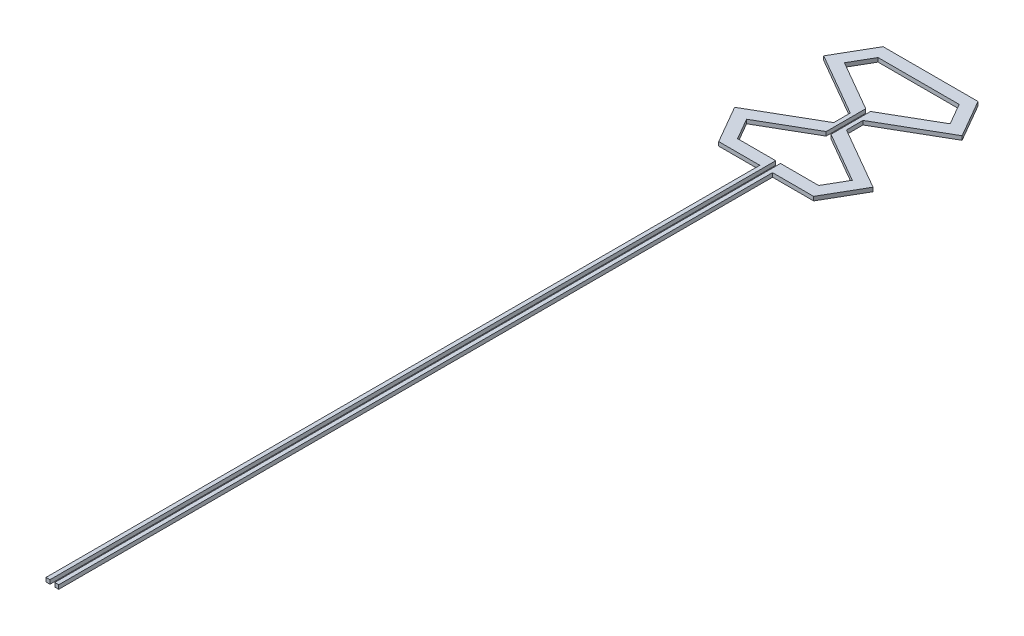
ISO-10303-21;
HEADER;
FILE_DESCRIPTION(('STEP AP214'),'2;1');
FILE_NAME('part.step','',(''),(''),'','','');
FILE_SCHEMA(('AUTOMOTIVE_DESIGN { 1 0 10303 214 1 1 1 1 }'));
ENDSEC;
DATA;
#1=APPLICATION_CONTEXT('core data for automotive mechanical design processes');
#2=APPLICATION_PROTOCOL_DEFINITION('international standard','automotive_design',2000,#1);
#3=PRODUCT_CONTEXT('',#1,'mechanical');
#4=PRODUCT('Part','Part','',(#3));
#5=PRODUCT_RELATED_PRODUCT_CATEGORY('part','',(#4));
#6=PRODUCT_DEFINITION_FORMATION('','',#4);
#7=PRODUCT_DEFINITION_CONTEXT('part definition',#1,'design');
#8=PRODUCT_DEFINITION('design','',#6,#7);
#9=PRODUCT_DEFINITION_SHAPE('','',#8);
#10=(LENGTH_UNIT() NAMED_UNIT(*) SI_UNIT(.MILLI.,.METRE.));
#11=(NAMED_UNIT(*) PLANE_ANGLE_UNIT() SI_UNIT($,.RADIAN.));
#12=(NAMED_UNIT(*) SI_UNIT($,.STERADIAN.) SOLID_ANGLE_UNIT());
#13=UNCERTAINTY_MEASURE_WITH_UNIT(LENGTH_MEASURE(1.E-05),#10,'distance_accuracy_value','');
#14=(GEOMETRIC_REPRESENTATION_CONTEXT(3) GLOBAL_UNCERTAINTY_ASSIGNED_CONTEXT((#13)) GLOBAL_UNIT_ASSIGNED_CONTEXT((#10,
#11,#12)) REPRESENTATION_CONTEXT('',''));
#15=CARTESIAN_POINT('',(0.,0.,0.));
#16=DIRECTION('',(0.,0.,1.));
#17=DIRECTION('',(1.,0.,0.));
#18=AXIS2_PLACEMENT_3D('',#15,#16,#17);
#19=CARTESIAN_POINT('',(-11.9226497308105,1.,20.6506350946109));
#20=DIRECTION('',(0.,0.,-1.));
#21=DIRECTION('',(-1.,0.,0.));
#22=AXIS2_PLACEMENT_3D('',#19,#20,#21);
#23=PLANE('',#22);
#24=DIRECTION('',(0.,-1.,0.));
#25=VECTOR('',#24,1.);
#26=CARTESIAN_POINT('',(1.60024211867001,1.,20.6506350946109));
#27=LINE('',#26,#25);
#28=CARTESIAN_POINT('',(1.60024211867001,1.,20.6506350946109));
#29=VERTEX_POINT('',#28);
#30=CARTESIAN_POINT('',(1.60024211867001,0.,20.6506350946109));
#31=VERTEX_POINT('',#30);
#32=EDGE_CURVE('E274',#29,#31,#27,.T.);
#33=ORIENTED_EDGE('',*,*,#32,.T.);
#34=DIRECTION('',(1.,0.,0.));
#35=VECTOR('',#34,1.);
#36=CARTESIAN_POINT('',(-11.9226497308105,0.,20.6506350946109));
#37=LINE('',#36,#35);
#38=CARTESIAN_POINT('',(11.9226497308103,0.,20.6506350946111));
#39=VERTEX_POINT('',#38);
#40=EDGE_CURVE('E291',#31,#39,#37,.T.);
#41=ORIENTED_EDGE('',*,*,#40,.T.);
#42=DIRECTION('',(0.,-1.,0.));
#43=VECTOR('',#42,1.);
#44=CARTESIAN_POINT('',(11.9226497308103,1.,20.6506350946111));
#45=LINE('',#44,#43);
#46=CARTESIAN_POINT('',(11.9226497308103,1.,20.6506350946111));
#47=VERTEX_POINT('',#46);
#48=EDGE_CURVE('E283',#47,#39,#45,.T.);
#49=ORIENTED_EDGE('',*,*,#48,.F.);
#50=DIRECTION('',(1.,0.,0.));
#51=VECTOR('',#50,1.);
#52=CARTESIAN_POINT('',(-11.9226497308105,1.,20.6506350946109));
#53=LINE('',#52,#51);
#54=EDGE_CURVE('E254',#29,#47,#53,.T.);
#55=ORIENTED_EDGE('',*,*,#54,.F.);
#56=EDGE_LOOP('',(#33,#41,#49,#55));
#57=FACE_BOUND('',#56,.T.);
#58=ADVANCED_FACE('F35',(#57),#23,.F.);
#59=CARTESIAN_POINT('',(-1.28152696787787E-13,1.,-1.15470053837918));
#60=DIRECTION('',(-0.5,0.,-0.866025403784439));
#61=DIRECTION('',(-0.866025403784439,0.,0.5));
#62=AXIS2_PLACEMENT_3D('',#59,#60,#61);
#63=PLANE('',#62);
#64=DIRECTION('',(0.,-1.,0.));
#65=VECTOR('',#64,1.);
#66=CARTESIAN_POINT('',(1.60024211867001,1.,-2.07860075636196));
#67=LINE('',#66,#65);
#68=CARTESIAN_POINT('',(1.60024211867001,1.,-2.07860075636196));
#69=VERTEX_POINT('',#68);
#70=CARTESIAN_POINT('',(1.60024211867001,0.,-2.07860075636196));
#71=VERTEX_POINT('',#70);
#72=EDGE_CURVE('E321',#69,#71,#67,.T.);
#73=ORIENTED_EDGE('',*,*,#72,.T.);
#74=DIRECTION('',(0.866025403784439,0.,-0.5));
#75=VECTOR('',#74,1.);
#76=CARTESIAN_POINT('',(-1.28152696787787E-13,0.,-1.15470053837918));
#77=LINE('',#76,#75);
#78=CARTESIAN_POINT('',(17.3839745962155,0.,-11.1913429510899));
#79=VERTEX_POINT('',#78);
#80=EDGE_CURVE('E452',#71,#79,#77,.T.);
#81=ORIENTED_EDGE('',*,*,#80,.T.);
#82=DIRECTION('',(0.,-1.,0.));
#83=VECTOR('',#82,1.);
#84=CARTESIAN_POINT('',(17.3839745962155,1.,-11.1913429510899));
#85=LINE('',#84,#83);
#86=CARTESIAN_POINT('',(17.3839745962155,1.,-11.1913429510899));
#87=VERTEX_POINT('',#86);
#88=EDGE_CURVE('E461',#87,#79,#85,.T.);
#89=ORIENTED_EDGE('',*,*,#88,.F.);
#90=DIRECTION('',(0.866025403784439,0.,-0.5));
#91=VECTOR('',#90,1.);
#92=CARTESIAN_POINT('',(-1.28152696787787E-13,1.,-1.15470053837918));
#93=LINE('',#92,#91);
#94=EDGE_CURVE('E459',#69,#87,#93,.T.);
#95=ORIENTED_EDGE('',*,*,#94,.F.);
#96=EDGE_LOOP('',(#73,#81,#89,#95));
#97=FACE_BOUND('',#96,.T.);
#98=ADVANCED_FACE('F545',(#97),#63,.F.);
#99=CARTESIAN_POINT('',(-11.9226497308105,1.,20.6506350946109));
#100=DIRECTION('',(0.,0.,-1.));
#101=DIRECTION('',(-1.,0.,0.));
#102=AXIS2_PLACEMENT_3D('',#99,#100,#101);
#103=PLANE('',#102);
#104=DIRECTION('',(0.,-1.,0.));
#105=VECTOR('',#104,1.);
#106=CARTESIAN_POINT('',(-1.60024211867012,1.,20.6506350946109));
#107=LINE('',#106,#105);
#108=CARTESIAN_POINT('',(-1.60024211867012,1.,20.650635094611));
#109=VERTEX_POINT('',#108);
#110=CARTESIAN_POINT('',(-1.60024211867012,0.,20.6506350946109));
#111=VERTEX_POINT('',#110);
#112=EDGE_CURVE('E50',#109,#111,#107,.T.);
#113=ORIENTED_EDGE('',*,*,#112,.F.);
#114=DIRECTION('',(1.,0.,0.));
#115=VECTOR('',#114,1.);
#116=CARTESIAN_POINT('',(-11.9226497308105,1.,20.6506350946109));
#117=LINE('',#116,#115);
#118=CARTESIAN_POINT('',(-11.9226497308105,1.,20.6506350946109));
#119=VERTEX_POINT('',#118);
#120=EDGE_CURVE('E375',#119,#109,#117,.T.);
#121=ORIENTED_EDGE('',*,*,#120,.F.);
#122=DIRECTION('',(0.,-1.,0.));
#123=VECTOR('',#122,1.);
#124=CARTESIAN_POINT('',(-11.9226497308105,1.,20.6506350946109));
#125=LINE('',#124,#123);
#126=CARTESIAN_POINT('',(-11.9226497308105,0.,20.6506350946109));
#127=VERTEX_POINT('',#126);
#128=EDGE_CURVE('E382',#119,#127,#125,.T.);
#129=ORIENTED_EDGE('',*,*,#128,.T.);
#130=DIRECTION('',(1.,0.,0.));
#131=VECTOR('',#130,1.);
#132=CARTESIAN_POINT('',(-11.9226497308105,0.,20.6506350946109));
#133=LINE('',#132,#131);
#134=EDGE_CURVE('E374',#127,#111,#133,.T.);
#135=ORIENTED_EDGE('',*,*,#134,.T.);
#136=EDGE_LOOP('',(#113,#121,#129,#135));
#137=FACE_BOUND('',#136,.T.);
#138=ADVANCED_FACE('F624',(#137),#103,.F.);
#139=CARTESIAN_POINT('',(-17.3839745962157,1.,-11.1913429510898));
#140=DIRECTION('',(0.5,0.,-0.866025403784439));
#141=DIRECTION('',(-0.866025403784439,0.,-0.5));
#142=AXIS2_PLACEMENT_3D('',#139,#140,#141);
#143=PLANE('',#142);
#144=DIRECTION('',(0.,-1.,0.));
#145=VECTOR('',#144,1.);
#146=CARTESIAN_POINT('',(-1.60024211867012,1.,-2.07860075636188));
#147=LINE('',#146,#145);
#148=CARTESIAN_POINT('',(-1.60024211867012,1.,-2.07860075636188));
#149=VERTEX_POINT('',#148);
#150=CARTESIAN_POINT('',(-1.60024211867012,0.,-2.07860075636188));
#151=VERTEX_POINT('',#150);
#152=EDGE_CURVE('E402',#149,#151,#147,.T.);
#153=ORIENTED_EDGE('',*,*,#152,.F.);
#154=DIRECTION('',(0.866025403784439,0.,0.5));
#155=VECTOR('',#154,1.);
#156=CARTESIAN_POINT('',(-17.3839745962157,1.,-11.1913429510898));
#157=LINE('',#156,#155);
#158=CARTESIAN_POINT('',(-17.3839745962157,1.,-11.1913429510898));
#159=VERTEX_POINT('',#158);
#160=EDGE_CURVE('E456',#159,#149,#157,.T.);
#161=ORIENTED_EDGE('',*,*,#160,.F.);
#162=DIRECTION('',(0.,-1.,0.));
#163=VECTOR('',#162,1.);
#164=CARTESIAN_POINT('',(-17.3839745962157,1.,-11.1913429510898));
#165=LINE('',#164,#163);
#166=CARTESIAN_POINT('',(-17.3839745962157,0.,-11.1913429510898));
#167=VERTEX_POINT('',#166);
#168=EDGE_CURVE('E474',#159,#167,#165,.T.);
#169=ORIENTED_EDGE('',*,*,#168,.T.);
#170=DIRECTION('',(0.866025403784439,0.,0.5));
#171=VECTOR('',#170,1.);
#172=CARTESIAN_POINT('',(-17.3839745962157,0.,-11.1913429510898));
#173=LINE('',#172,#171);
#174=EDGE_CURVE('E468',#167,#151,#173,.T.);
#175=ORIENTED_EDGE('',*,*,#174,.T.);
#176=EDGE_LOOP('',(#153,#161,#169,#175));
#177=FACE_BOUND('',#176,.T.);
#178=ADVANCED_FACE('F562',(#177),#143,.F.);
#179=CARTESIAN_POINT('',(0.,1.,0.));
#180=DIRECTION('',(0.,-1.,0.));
#181=DIRECTION('',(0.,0.,-1.));
#182=AXIS2_PLACEMENT_3D('',#179,#180,#181);
#183=PLANE('',#182);
#184=DIRECTION('',(0.,0.,1.));
#185=VECTOR('',#184,1.);
#186=CARTESIAN_POINT('',(-0.600242118670122,1.,0.));
#187=LINE('',#186,#185);
#188=CARTESIAN_POINT('',(-0.600242118670121,1.,-4.96535210231015));
#189=VERTEX_POINT('',#188);
#190=CARTESIAN_POINT('',(-0.600242118670122,1.,4.96535210231013));
#191=VERTEX_POINT('',#190);
#192=EDGE_CURVE('E410',#189,#191,#187,.T.);
#193=ORIENTED_EDGE('',*,*,#192,.F.);
#194=DIRECTION('',(0.866025403784439,0.,0.5));
#195=VECTOR('',#194,1.);
#196=CARTESIAN_POINT('',(-13.2858983848622,1.,-12.2894191624432));
#197=LINE('',#196,#195);
#198=CARTESIAN_POINT('',(-13.2858983848622,1.,-12.2894191624432));
#199=VERTEX_POINT('',#198);
#200=EDGE_CURVE('E420',#199,#189,#197,.T.);
#201=ORIENTED_EDGE('',*,*,#200,.F.);
#202=DIRECTION('',(-0.5,0.,0.866025403784439));
#203=VECTOR('',#202,1.);
#204=CARTESIAN_POINT('',(-10.1905989232415,1.,-17.650635094611));
#205=LINE('',#204,#203);
#206=CARTESIAN_POINT('',(-10.1905989232415,1.,-17.650635094611));
#207=VERTEX_POINT('',#206);
#208=EDGE_CURVE('E418',#207,#199,#205,.T.);
#209=ORIENTED_EDGE('',*,*,#208,.F.);
#210=DIRECTION('',(-1.,0.,0.));
#211=VECTOR('',#210,1.);
#212=CARTESIAN_POINT('',(10.1905989232415,1.,-17.650635094611));
#213=LINE('',#212,#211);
#214=CARTESIAN_POINT('',(10.1905989232415,1.,-17.650635094611));
#215=VERTEX_POINT('',#214);
#216=EDGE_CURVE('E415',#215,#207,#213,.T.);
#217=ORIENTED_EDGE('',*,*,#216,.F.);
#218=DIRECTION('',(-0.5,0.,-0.866025403784438));
#219=VECTOR('',#218,1.);
#220=CARTESIAN_POINT('',(13.2858983848623,1.,-12.2894191624432));
#221=LINE('',#220,#219);
#222=CARTESIAN_POINT('',(13.2858983848623,1.,-12.2894191624432));
#223=VERTEX_POINT('',#222);
#224=EDGE_CURVE('E413',#223,#215,#221,.T.);
#225=ORIENTED_EDGE('',*,*,#224,.F.);
#226=DIRECTION('',(0.866025403784439,0.,-0.5));
#227=VECTOR('',#226,1.);
#228=CARTESIAN_POINT('',(0.,1.,-4.618802153517));
#229=LINE('',#228,#227);
#230=CARTESIAN_POINT('',(0.600242118670006,1.,-4.96535210231009));
#231=VERTEX_POINT('',#230);
#232=EDGE_CURVE('E423',#231,#223,#229,.T.);
#233=ORIENTED_EDGE('',*,*,#232,.F.);
#234=DIRECTION('',(0.,0.,-1.));
#235=VECTOR('',#234,1.);
#236=CARTESIAN_POINT('',(0.600242118670006,1.,0.));
#237=LINE('',#236,#235);
#238=CARTESIAN_POINT('',(0.600242118670005,1.,4.96535210231011));
#239=VERTEX_POINT('',#238);
#240=EDGE_CURVE('E407',#239,#231,#237,.T.);
#241=ORIENTED_EDGE('',*,*,#240,.F.);
#242=DIRECTION('',(-0.866025403784435,0.,-0.500000000000005));
#243=VECTOR('',#242,1.);
#244=CARTESIAN_POINT('',(13.2858983848622,1.,12.2894191624433));
#245=LINE('',#244,#243);
#246=CARTESIAN_POINT('',(13.2858983848622,1.,12.2894191624433));
#247=VERTEX_POINT('',#246);
#248=EDGE_CURVE('E282',#247,#239,#245,.T.);
#249=ORIENTED_EDGE('',*,*,#248,.F.);
#250=DIRECTION('',(0.500000000000006,0.,-0.866025403784435));
#251=VECTOR('',#250,1.);
#252=CARTESIAN_POINT('',(10.1905989232414,1.,17.6506350946111));
#253=LINE('',#252,#251);
#254=CARTESIAN_POINT('',(10.1905989232414,1.,17.6506350946111));
#255=VERTEX_POINT('',#254);
#256=EDGE_CURVE('E286',#255,#247,#253,.T.);
#257=ORIENTED_EDGE('',*,*,#256,.F.);
#258=DIRECTION('',(1.,0.,0.));
#259=VECTOR('',#258,1.);
#260=CARTESIAN_POINT('',(-10.1905989232416,1.,17.6506350946109));
#261=LINE('',#260,#259);
#262=CARTESIAN_POINT('',(0.600242118670005,1.,17.650635094611));
#263=VERTEX_POINT('',#262);
#264=EDGE_CURVE('E250',#263,#255,#261,.T.);
#265=ORIENTED_EDGE('',*,*,#264,.F.);
#266=DIRECTION('',(0.,0.,1.));
#267=VECTOR('',#266,1.);
#268=CARTESIAN_POINT('',(0.600242118670006,1.,0.));
#269=LINE('',#268,#267);
#270=CARTESIAN_POINT('',(0.600242118670017,1.,200.));
#271=VERTEX_POINT('',#270);
#272=EDGE_CURVE('E243',#263,#271,#269,.T.);
#273=ORIENTED_EDGE('',*,*,#272,.T.);
#274=DIRECTION('',(1.,0.,0.));
#275=VECTOR('',#274,1.);
#276=CARTESIAN_POINT('',(0.600242118670017,1.,200.));
#277=LINE('',#276,#275);
#278=CARTESIAN_POINT('',(1.60024211867002,1.,200.));
#279=VERTEX_POINT('',#278);
#280=EDGE_CURVE('E247',#271,#279,#277,.T.);
#281=ORIENTED_EDGE('',*,*,#280,.T.);
#282=DIRECTION('',(0.,0.,-1.));
#283=VECTOR('',#282,1.);
#284=CARTESIAN_POINT('',(1.60024211867001,1.,20.6506350946109));
#285=LINE('',#284,#283);
#286=EDGE_CURVE('E264',#279,#29,#285,.T.);
#287=ORIENTED_EDGE('',*,*,#286,.T.);
#288=ORIENTED_EDGE('',*,*,#54,.T.);
#289=DIRECTION('',(0.500000000000006,0.,-0.866025403784435));
#290=VECTOR('',#289,1.);
#291=CARTESIAN_POINT('',(11.9226497308103,1.,20.6506350946111));
#292=LINE('',#291,#290);
#293=CARTESIAN_POINT('',(17.3839745962156,1.,11.19134295109));
#294=VERTEX_POINT('',#293);
#295=EDGE_CURVE('E295',#47,#294,#292,.T.);
#296=ORIENTED_EDGE('',*,*,#295,.T.);
#297=DIRECTION('',(-0.866025403784435,0.,-0.500000000000006));
#298=VECTOR('',#297,1.);
#299=CARTESIAN_POINT('',(17.3839745962156,1.,11.19134295109));
#300=LINE('',#299,#298);
#301=CARTESIAN_POINT('',(1.60024211867001,1.,2.07860075636183));
#302=VERTEX_POINT('',#301);
#303=EDGE_CURVE('E255',#294,#302,#300,.T.);
#304=ORIENTED_EDGE('',*,*,#303,.T.);
#305=DIRECTION('',(0.,0.,-1.));
#306=VECTOR('',#305,1.);
#307=CARTESIAN_POINT('',(1.60024211867001,1.,2.07860075636183));
#308=LINE('',#307,#306);
#309=EDGE_CURVE('E319',#302,#69,#308,.T.);
#310=ORIENTED_EDGE('',*,*,#309,.T.);
#311=ORIENTED_EDGE('',*,*,#94,.T.);
#312=DIRECTION('',(-0.5,0.,-0.866025403784439));
#313=VECTOR('',#312,1.);
#314=CARTESIAN_POINT('',(17.3839745962155,1.,-11.1913429510899));
#315=LINE('',#314,#313);
#316=CARTESIAN_POINT('',(11.9226497308103,1.,-20.650635094611));
#317=VERTEX_POINT('',#316);
#318=EDGE_CURVE('E448',#87,#317,#315,.T.);
#319=ORIENTED_EDGE('',*,*,#318,.T.);
#320=DIRECTION('',(-1.,0.,0.));
#321=VECTOR('',#320,1.);
#322=CARTESIAN_POINT('',(11.9226497308103,1.,-20.650635094611));
#323=LINE('',#322,#321);
#324=CARTESIAN_POINT('',(-11.9226497308104,1.,-20.650635094611));
#325=VERTEX_POINT('',#324);
#326=EDGE_CURVE('E451',#317,#325,#323,.T.);
#327=ORIENTED_EDGE('',*,*,#326,.T.);
#328=DIRECTION('',(-0.5,0.,0.866025403784439));
#329=VECTOR('',#328,1.);
#330=CARTESIAN_POINT('',(-11.9226497308104,1.,-20.650635094611));
#331=LINE('',#330,#329);
#332=EDGE_CURVE('E454',#325,#159,#331,.T.);
#333=ORIENTED_EDGE('',*,*,#332,.T.);
#334=ORIENTED_EDGE('',*,*,#160,.T.);
#335=DIRECTION('',(0.,0.,1.));
#336=VECTOR('',#335,1.);
#337=CARTESIAN_POINT('',(-1.60024211867012,1.,2.078600756362));
#338=LINE('',#337,#336);
#339=CARTESIAN_POINT('',(-1.60024211867012,1.,2.078600756362));
#340=VERTEX_POINT('',#339);
#341=EDGE_CURVE('E396',#149,#340,#338,.T.);
#342=ORIENTED_EDGE('',*,*,#341,.T.);
#343=DIRECTION('',(-0.866025403784442,0.,0.499999999999994));
#344=VECTOR('',#343,1.);
#345=CARTESIAN_POINT('',(1.20089466024381E-13,1.,1.15470053837918));
#346=LINE('',#345,#344);
#347=CARTESIAN_POINT('',(-17.3839745962156,1.,11.1913429510898));
#348=VERTEX_POINT('',#347);
#349=EDGE_CURVE('E377',#340,#348,#346,.T.);
#350=ORIENTED_EDGE('',*,*,#349,.T.);
#351=DIRECTION('',(0.499999999999994,0.,0.866025403784442));
#352=VECTOR('',#351,1.);
#353=CARTESIAN_POINT('',(-17.3839745962156,1.,11.1913429510898));
#354=LINE('',#353,#352);
#355=EDGE_CURVE('E380',#348,#119,#354,.T.);
#356=ORIENTED_EDGE('',*,*,#355,.T.);
#357=ORIENTED_EDGE('',*,*,#120,.T.);
#358=DIRECTION('',(0.,0.,1.));
#359=VECTOR('',#358,1.);
#360=CARTESIAN_POINT('',(-1.60024211867012,1.,20.6506350946109));
#361=LINE('',#360,#359);
#362=CARTESIAN_POINT('',(-1.60024211867007,1.,200.));
#363=VERTEX_POINT('',#362);
#364=EDGE_CURVE('E329',#109,#363,#361,.T.);
#365=ORIENTED_EDGE('',*,*,#364,.T.);
#366=DIRECTION('',(1.,0.,0.));
#367=VECTOR('',#366,1.);
#368=CARTESIAN_POINT('',(-0.600242118670067,1.,200.));
#369=LINE('',#368,#367);
#370=CARTESIAN_POINT('',(-0.600242118670067,1.,200.));
#371=VERTEX_POINT('',#370);
#372=EDGE_CURVE('E331',#363,#371,#369,.T.);
#373=ORIENTED_EDGE('',*,*,#372,.T.);
#374=DIRECTION('',(0.,0.,-1.));
#375=VECTOR('',#374,1.);
#376=CARTESIAN_POINT('',(-0.600242118670122,1.,0.));
#377=LINE('',#376,#375);
#378=CARTESIAN_POINT('',(-0.600242118670121,1.,17.650635094611));
#379=VERTEX_POINT('',#378);
#380=EDGE_CURVE('E348',#371,#379,#377,.T.);
#381=ORIENTED_EDGE('',*,*,#380,.T.);
#382=DIRECTION('',(1.,0.,0.));
#383=VECTOR('',#382,1.);
#384=CARTESIAN_POINT('',(-10.1905989232416,1.,17.6506350946109));
#385=LINE('',#384,#383);
#386=CARTESIAN_POINT('',(-10.1905989232416,1.,17.6506350946109));
#387=VERTEX_POINT('',#386);
#388=EDGE_CURVE('E354',#387,#379,#385,.T.);
#389=ORIENTED_EDGE('',*,*,#388,.F.);
#390=DIRECTION('',(0.499999999999994,0.,0.866025403784442));
#391=VECTOR('',#390,1.);
#392=CARTESIAN_POINT('',(-13.2858983848623,1.,12.2894191624432));
#393=LINE('',#392,#391);
#394=CARTESIAN_POINT('',(-13.2858983848623,1.,12.2894191624432));
#395=VERTEX_POINT('',#394);
#396=EDGE_CURVE('E360',#395,#387,#393,.T.);
#397=ORIENTED_EDGE('',*,*,#396,.F.);
#398=DIRECTION('',(-0.866025403784442,0.,0.499999999999994));
#399=VECTOR('',#398,1.);
#400=CARTESIAN_POINT('',(0.,1.,4.618802153517));
#401=LINE('',#400,#399);
#402=EDGE_CURVE('E357',#191,#395,#401,.T.);
#403=ORIENTED_EDGE('',*,*,#402,.F.);
#404=EDGE_LOOP('',(#193,#201,#209,#217,#225,#233,#241,#249,#257,#265,#273,#281,#287,#288,#296,
#304,#310,#311,#319,#327,#333,#334,#342,#350,#356,#357,#365,#373,#381,#389,#397,#403));
#405=FACE_BOUND('',#404,.T.);
#406=ADVANCED_FACE('F246',(#405),#183,.F.);
#407=CARTESIAN_POINT('',(0.,0.,0.));
#408=DIRECTION('',(0.,-1.,0.));
#409=DIRECTION('',(0.,0.,-1.));
#410=AXIS2_PLACEMENT_3D('',#407,#408,#409);
#411=PLANE('',#410);
#412=DIRECTION('',(0.866025403784439,0.,0.5));
#413=VECTOR('',#412,1.);
#414=CARTESIAN_POINT('',(-13.2858983848622,0.,-12.2894191624432));
#415=LINE('',#414,#413);
#416=CARTESIAN_POINT('',(-13.2858983848622,0.,-12.2894191624432));
#417=VERTEX_POINT('',#416);
#418=CARTESIAN_POINT('',(-0.600242118670121,0.,-4.96535210231015));
#419=VERTEX_POINT('',#418);
#420=EDGE_CURVE('E434',#417,#419,#415,.T.);
#421=ORIENTED_EDGE('',*,*,#420,.T.);
#422=DIRECTION('',(0.,0.,1.));
#423=VECTOR('',#422,1.);
#424=CARTESIAN_POINT('',(-0.600242118670122,0.,0.));
#425=LINE('',#424,#423);
#426=CARTESIAN_POINT('',(-0.600242118670122,0.,4.96535210231013));
#427=VERTEX_POINT('',#426);
#428=EDGE_CURVE('E58',#419,#427,#425,.T.);
#429=ORIENTED_EDGE('',*,*,#428,.T.);
#430=DIRECTION('',(-0.866025403784442,0.,0.499999999999994));
#431=VECTOR('',#430,1.);
#432=CARTESIAN_POINT('',(0.,0.,4.618802153517));
#433=LINE('',#432,#431);
#434=CARTESIAN_POINT('',(-13.2858983848623,0.,12.2894191624432));
#435=VERTEX_POINT('',#434);
#436=EDGE_CURVE('E365',#427,#435,#433,.T.);
#437=ORIENTED_EDGE('',*,*,#436,.T.);
#438=DIRECTION('',(0.499999999999994,0.,0.866025403784442));
#439=VECTOR('',#438,1.);
#440=CARTESIAN_POINT('',(-13.2858983848623,0.,12.2894191624432));
#441=LINE('',#440,#439);
#442=CARTESIAN_POINT('',(-10.1905989232416,0.,17.6506350946109));
#443=VERTEX_POINT('',#442);
#444=EDGE_CURVE('E358',#435,#443,#441,.T.);
#445=ORIENTED_EDGE('',*,*,#444,.T.);
#446=DIRECTION('',(1.,0.,0.));
#447=VECTOR('',#446,1.);
#448=CARTESIAN_POINT('',(-10.1905989232416,0.,17.6506350946109));
#449=LINE('',#448,#447);
#450=CARTESIAN_POINT('',(-0.600242118670121,0.,17.650635094611));
#451=VERTEX_POINT('',#450);
#452=EDGE_CURVE('E351',#443,#451,#449,.T.);
#453=ORIENTED_EDGE('',*,*,#452,.T.);
#454=DIRECTION('',(0.,0.,-1.));
#455=VECTOR('',#454,1.);
#456=CARTESIAN_POINT('',(-0.600242118670122,0.,0.));
#457=LINE('',#456,#455);
#458=CARTESIAN_POINT('',(-0.600242118670067,0.,200.));
#459=VERTEX_POINT('',#458);
#460=EDGE_CURVE('E346',#459,#451,#457,.T.);
#461=ORIENTED_EDGE('',*,*,#460,.F.);
#462=DIRECTION('',(1.,0.,0.));
#463=VECTOR('',#462,1.);
#464=CARTESIAN_POINT('',(-0.600242118670067,0.,200.));
#465=LINE('',#464,#463);
#466=CARTESIAN_POINT('',(-1.60024211867007,0.,200.));
#467=VERTEX_POINT('',#466);
#468=EDGE_CURVE('E332',#467,#459,#465,.T.);
#469=ORIENTED_EDGE('',*,*,#468,.F.);
#470=DIRECTION('',(0.,0.,1.));
#471=VECTOR('',#470,1.);
#472=CARTESIAN_POINT('',(-1.60024211867012,0.,20.6506350946109));
#473=LINE('',#472,#471);
#474=EDGE_CURVE('E328',#111,#467,#473,.T.);
#475=ORIENTED_EDGE('',*,*,#474,.F.);
#476=ORIENTED_EDGE('',*,*,#134,.F.);
#477=DIRECTION('',(0.499999999999994,0.,0.866025403784442));
#478=VECTOR('',#477,1.);
#479=CARTESIAN_POINT('',(-17.3839745962156,0.,11.1913429510898));
#480=LINE('',#479,#478);
#481=CARTESIAN_POINT('',(-17.3839745962156,0.,11.1913429510898));
#482=VERTEX_POINT('',#481);
#483=EDGE_CURVE('E378',#482,#127,#480,.T.);
#484=ORIENTED_EDGE('',*,*,#483,.F.);
#485=DIRECTION('',(-0.866025403784442,0.,0.499999999999994));
#486=VECTOR('',#485,1.);
#487=CARTESIAN_POINT('',(1.20089466024381E-13,0.,1.15470053837918));
#488=LINE('',#487,#486);
#489=CARTESIAN_POINT('',(-1.60024211867012,0.,2.078600756362));
#490=VERTEX_POINT('',#489);
#491=EDGE_CURVE('E384',#490,#482,#488,.T.);
#492=ORIENTED_EDGE('',*,*,#491,.F.);
#493=DIRECTION('',(0.,0.,1.));
#494=VECTOR('',#493,1.);
#495=CARTESIAN_POINT('',(-1.60024211867012,0.,2.078600756362));
#496=LINE('',#495,#494);
#497=EDGE_CURVE('E395',#151,#490,#496,.T.);
#498=ORIENTED_EDGE('',*,*,#497,.F.);
#499=ORIENTED_EDGE('',*,*,#174,.F.);
#500=DIRECTION('',(-0.5,0.,0.866025403784439));
#501=VECTOR('',#500,1.);
#502=CARTESIAN_POINT('',(-11.9226497308104,0.,-20.650635094611));
#503=LINE('',#502,#501);
#504=CARTESIAN_POINT('',(-11.9226497308104,0.,-20.650635094611));
#505=VERTEX_POINT('',#504);
#506=EDGE_CURVE('E466',#505,#167,#503,.T.);
#507=ORIENTED_EDGE('',*,*,#506,.F.);
#508=DIRECTION('',(-1.,0.,0.));
#509=VECTOR('',#508,1.);
#510=CARTESIAN_POINT('',(11.9226497308103,0.,-20.650635094611));
#511=LINE('',#510,#509);
#512=CARTESIAN_POINT('',(11.9226497308103,0.,-20.650635094611));
#513=VERTEX_POINT('',#512);
#514=EDGE_CURVE('E464',#513,#505,#511,.T.);
#515=ORIENTED_EDGE('',*,*,#514,.F.);
#516=DIRECTION('',(-0.5,0.,-0.866025403784439));
#517=VECTOR('',#516,1.);
#518=CARTESIAN_POINT('',(17.3839745962155,0.,-11.1913429510899));
#519=LINE('',#518,#517);
#520=EDGE_CURVE('E447',#79,#513,#519,.T.);
#521=ORIENTED_EDGE('',*,*,#520,.F.);
#522=ORIENTED_EDGE('',*,*,#80,.F.);
#523=DIRECTION('',(0.,0.,-1.));
#524=VECTOR('',#523,1.);
#525=CARTESIAN_POINT('',(1.60024211867001,0.,2.07860075636183));
#526=LINE('',#525,#524);
#527=CARTESIAN_POINT('',(1.60024211867001,0.,2.07860075636183));
#528=VERTEX_POINT('',#527);
#529=EDGE_CURVE('E314',#528,#71,#526,.T.);
#530=ORIENTED_EDGE('',*,*,#529,.F.);
#531=DIRECTION('',(-0.866025403784435,0.,-0.500000000000006));
#532=VECTOR('',#531,1.);
#533=CARTESIAN_POINT('',(17.3839745962156,0.,11.19134295109));
#534=LINE('',#533,#532);
#535=CARTESIAN_POINT('',(17.3839745962156,0.,11.19134295109));
#536=VERTEX_POINT('',#535);
#537=EDGE_CURVE('E290',#536,#528,#534,.T.);
#538=ORIENTED_EDGE('',*,*,#537,.F.);
#539=DIRECTION('',(0.500000000000006,0.,-0.866025403784435));
#540=VECTOR('',#539,1.);
#541=CARTESIAN_POINT('',(11.9226497308103,0.,20.6506350946111));
#542=LINE('',#541,#540);
#543=EDGE_CURVE('E281',#39,#536,#542,.T.);
#544=ORIENTED_EDGE('',*,*,#543,.F.);
#545=ORIENTED_EDGE('',*,*,#40,.F.);
#546=DIRECTION('',(0.,0.,-1.));
#547=VECTOR('',#546,1.);
#548=CARTESIAN_POINT('',(1.60024211867001,0.,20.6506350946109));
#549=LINE('',#548,#547);
#550=CARTESIAN_POINT('',(1.60024211867002,0.,200.));
#551=VERTEX_POINT('',#550);
#552=EDGE_CURVE('E265',#551,#31,#549,.T.);
#553=ORIENTED_EDGE('',*,*,#552,.F.);
#554=DIRECTION('',(1.,0.,0.));
#555=VECTOR('',#554,1.);
#556=CARTESIAN_POINT('',(0.600242118670017,0.,200.));
#557=LINE('',#556,#555);
#558=CARTESIAN_POINT('',(0.600242118670017,0.,200.));
#559=VERTEX_POINT('',#558);
#560=EDGE_CURVE('E517',#559,#551,#557,.T.);
#561=ORIENTED_EDGE('',*,*,#560,.F.);
#562=DIRECTION('',(0.,0.,1.));
#563=VECTOR('',#562,1.);
#564=CARTESIAN_POINT('',(0.600242118670006,0.,0.));
#565=LINE('',#564,#563);
#566=CARTESIAN_POINT('',(0.600242118670005,0.,17.650635094611));
#567=VERTEX_POINT('',#566);
#568=EDGE_CURVE('E269',#567,#559,#565,.T.);
#569=ORIENTED_EDGE('',*,*,#568,.F.);
#570=DIRECTION('',(1.,0.,0.));
#571=VECTOR('',#570,1.);
#572=CARTESIAN_POINT('',(-10.1905989232416,0.,17.6506350946109));
#573=LINE('',#572,#571);
#574=CARTESIAN_POINT('',(10.1905989232414,0.,17.6506350946111));
#575=VERTEX_POINT('',#574);
#576=EDGE_CURVE('E297',#567,#575,#573,.T.);
#577=ORIENTED_EDGE('',*,*,#576,.T.);
#578=DIRECTION('',(0.500000000000006,0.,-0.866025403784435));
#579=VECTOR('',#578,1.);
#580=CARTESIAN_POINT('',(10.1905989232414,0.,17.6506350946111));
#581=LINE('',#580,#579);
#582=CARTESIAN_POINT('',(13.2858983848622,0.,12.2894191624433));
#583=VERTEX_POINT('',#582);
#584=EDGE_CURVE('E306',#575,#583,#581,.T.);
#585=ORIENTED_EDGE('',*,*,#584,.T.);
#586=DIRECTION('',(-0.866025403784435,0.,-0.500000000000005));
#587=VECTOR('',#586,1.);
#588=CARTESIAN_POINT('',(13.2858983848622,0.,12.2894191624433));
#589=LINE('',#588,#587);
#590=CARTESIAN_POINT('',(0.600242118670005,0.,4.96535210231011));
#591=VERTEX_POINT('',#590);
#592=EDGE_CURVE('E303',#583,#591,#589,.T.);
#593=ORIENTED_EDGE('',*,*,#592,.T.);
#594=DIRECTION('',(0.,0.,-1.));
#595=VECTOR('',#594,1.);
#596=CARTESIAN_POINT('',(0.600242118670006,0.,0.));
#597=LINE('',#596,#595);
#598=CARTESIAN_POINT('',(0.600242118670006,0.,-4.96535210231009));
#599=VERTEX_POINT('',#598);
#600=EDGE_CURVE('E404',#591,#599,#597,.T.);
#601=ORIENTED_EDGE('',*,*,#600,.T.);
#602=DIRECTION('',(0.866025403784439,0.,-0.5));
#603=VECTOR('',#602,1.);
#604=CARTESIAN_POINT('',(0.,0.,-4.618802153517));
#605=LINE('',#604,#603);
#606=CARTESIAN_POINT('',(13.2858983848623,0.,-12.2894191624432));
#607=VERTEX_POINT('',#606);
#608=EDGE_CURVE('E416',#599,#607,#605,.T.);
#609=ORIENTED_EDGE('',*,*,#608,.T.);
#610=DIRECTION('',(-0.5,0.,-0.866025403784438));
#611=VECTOR('',#610,1.);
#612=CARTESIAN_POINT('',(13.2858983848623,0.,-12.2894191624432));
#613=LINE('',#612,#611);
#614=CARTESIAN_POINT('',(10.1905989232415,0.,-17.650635094611));
#615=VERTEX_POINT('',#614);
#616=EDGE_CURVE('E412',#607,#615,#613,.T.);
#617=ORIENTED_EDGE('',*,*,#616,.T.);
#618=DIRECTION('',(-1.,0.,0.));
#619=VECTOR('',#618,1.);
#620=CARTESIAN_POINT('',(10.1905989232415,0.,-17.650635094611));
#621=LINE('',#620,#619);
#622=CARTESIAN_POINT('',(-10.1905989232415,0.,-17.650635094611));
#623=VERTEX_POINT('',#622);
#624=EDGE_CURVE('E428',#615,#623,#621,.T.);
#625=ORIENTED_EDGE('',*,*,#624,.T.);
#626=DIRECTION('',(-0.5,0.,0.866025403784439));
#627=VECTOR('',#626,1.);
#628=CARTESIAN_POINT('',(-10.1905989232415,0.,-17.650635094611));
#629=LINE('',#628,#627);
#630=EDGE_CURVE('E431',#623,#417,#629,.T.);
#631=ORIENTED_EDGE('',*,*,#630,.T.);
#632=EDGE_LOOP('',(#421,#429,#437,#445,#453,#461,#469,#475,#476,#484,#492,#498,#499,#507,#515,
#521,#522,#530,#538,#544,#545,#553,#561,#569,#577,#585,#593,#601,#609,#617,#625,#631));
#633=FACE_BOUND('',#632,.T.);
#634=ADVANCED_FACE('F503',(#633),#411,.T.);
#635=CARTESIAN_POINT('',(-13.2858983848622,1.,-12.2894191624432));
#636=DIRECTION('',(0.499999999999999,0.,-0.866025403784439));
#637=DIRECTION('',(-0.866025403784439,0.,-0.5));
#638=AXIS2_PLACEMENT_3D('',#635,#636,#637);
#639=PLANE('',#638);
#640=ORIENTED_EDGE('',*,*,#200,.T.);
#641=DIRECTION('',(0.,-1.,0.));
#642=VECTOR('',#641,1.);
#643=CARTESIAN_POINT('',(-0.600242118670121,1.,-4.96535210231015));
#644=LINE('',#643,#642);
#645=EDGE_CURVE('E11',#189,#419,#644,.T.);
#646=ORIENTED_EDGE('',*,*,#645,.T.);
#647=ORIENTED_EDGE('',*,*,#420,.F.);
#648=DIRECTION('',(0.,-1.,0.));
#649=VECTOR('',#648,1.);
#650=CARTESIAN_POINT('',(-13.2858983848622,1.,-12.2894191624432));
#651=LINE('',#650,#649);
#652=EDGE_CURVE('E440',#199,#417,#651,.T.);
#653=ORIENTED_EDGE('',*,*,#652,.F.);
#654=EDGE_LOOP('',(#640,#646,#647,#653));
#655=FACE_BOUND('',#654,.T.);
#656=ADVANCED_FACE('F605',(#655),#639,.T.);
#657=CARTESIAN_POINT('',(0.,1.,-4.618802153517));
#658=DIRECTION('',(-0.5,0.,-0.866025403784439));
#659=DIRECTION('',(-0.866025403784439,0.,0.5));
#660=AXIS2_PLACEMENT_3D('',#657,#658,#659);
#661=PLANE('',#660);
#662=ORIENTED_EDGE('',*,*,#608,.F.);
#663=DIRECTION('',(0.,1.,0.));
#664=VECTOR('',#663,1.);
#665=CARTESIAN_POINT('',(0.600242118670006,1.,-4.96535210231009));
#666=LINE('',#665,#664);
#667=EDGE_CURVE('E43',#599,#231,#666,.T.);
#668=ORIENTED_EDGE('',*,*,#667,.T.);
#669=ORIENTED_EDGE('',*,*,#232,.T.);
#670=DIRECTION('',(0.,-1.,0.));
#671=VECTOR('',#670,1.);
#672=CARTESIAN_POINT('',(13.2858983848623,1.,-12.2894191624432));
#673=LINE('',#672,#671);
#674=EDGE_CURVE('E425',#223,#607,#673,.T.);
#675=ORIENTED_EDGE('',*,*,#674,.T.);
#676=EDGE_LOOP('',(#662,#668,#669,#675));
#677=FACE_BOUND('',#676,.T.);
#678=ADVANCED_FACE('F486',(#677),#661,.T.);
#679=CARTESIAN_POINT('',(17.3839745962155,1.,-11.1913429510899));
#680=DIRECTION('',(-0.866025403784439,0.,0.5));
#681=DIRECTION('',(0.5,0.,0.866025403784439));
#682=AXIS2_PLACEMENT_3D('',#679,#680,#681);
#683=PLANE('',#682);
#684=ORIENTED_EDGE('',*,*,#520,.T.);
#685=DIRECTION('',(0.,-1.,0.));
#686=VECTOR('',#685,1.);
#687=CARTESIAN_POINT('',(11.9226497308103,1.,-20.650635094611));
#688=LINE('',#687,#686);
#689=EDGE_CURVE('E480',#317,#513,#688,.T.);
#690=ORIENTED_EDGE('',*,*,#689,.F.);
#691=ORIENTED_EDGE('',*,*,#318,.F.);
#692=ORIENTED_EDGE('',*,*,#88,.T.);
#693=EDGE_LOOP('',(#684,#690,#691,#692));
#694=FACE_BOUND('',#693,.T.);
#695=ADVANCED_FACE('F37',(#694),#683,.F.);
#696=CARTESIAN_POINT('',(11.9226497308103,1.,-20.650635094611));
#697=DIRECTION('',(0.,0.,1.));
#698=DIRECTION('',(1.,0.,0.));
#699=AXIS2_PLACEMENT_3D('',#696,#697,#698);
#700=PLANE('',#699);
#701=ORIENTED_EDGE('',*,*,#514,.T.);
#702=DIRECTION('',(0.,-1.,0.));
#703=VECTOR('',#702,1.);
#704=CARTESIAN_POINT('',(-11.9226497308104,1.,-20.650635094611));
#705=LINE('',#704,#703);
#706=EDGE_CURVE('E477',#325,#505,#705,.T.);
#707=ORIENTED_EDGE('',*,*,#706,.F.);
#708=ORIENTED_EDGE('',*,*,#326,.F.);
#709=ORIENTED_EDGE('',*,*,#689,.T.);
#710=EDGE_LOOP('',(#701,#707,#708,#709));
#711=FACE_BOUND('',#710,.T.);
#712=ADVANCED_FACE('F552',(#711),#700,.F.);
#713=CARTESIAN_POINT('',(-11.9226497308104,1.,-20.650635094611));
#714=DIRECTION('',(0.866025403784439,0.,0.5));
#715=DIRECTION('',(0.5,0.,-0.866025403784439));
#716=AXIS2_PLACEMENT_3D('',#713,#714,#715);
#717=PLANE('',#716);
#718=ORIENTED_EDGE('',*,*,#506,.T.);
#719=ORIENTED_EDGE('',*,*,#168,.F.);
#720=ORIENTED_EDGE('',*,*,#332,.F.);
#721=ORIENTED_EDGE('',*,*,#706,.T.);
#722=EDGE_LOOP('',(#718,#719,#720,#721));
#723=FACE_BOUND('',#722,.T.);
#724=ADVANCED_FACE('F557',(#723),#717,.F.);
#725=CARTESIAN_POINT('',(13.2858983848623,1.,-12.2894191624432));
#726=DIRECTION('',(-0.866025403784438,0.,0.5));
#727=DIRECTION('',(0.5,0.,0.866025403784439));
#728=AXIS2_PLACEMENT_3D('',#725,#726,#727);
#729=PLANE('',#728);
#730=ORIENTED_EDGE('',*,*,#616,.F.);
#731=ORIENTED_EDGE('',*,*,#674,.F.);
#732=ORIENTED_EDGE('',*,*,#224,.T.);
#733=DIRECTION('',(0.,-1.,0.));
#734=VECTOR('',#733,1.);
#735=CARTESIAN_POINT('',(10.1905989232415,1.,-17.650635094611));
#736=LINE('',#735,#734);
#737=EDGE_CURVE('E444',#215,#615,#736,.T.);
#738=ORIENTED_EDGE('',*,*,#737,.T.);
#739=EDGE_LOOP('',(#730,#731,#732,#738));
#740=FACE_BOUND('',#739,.T.);
#741=ADVANCED_FACE('F497',(#740),#729,.T.);
#742=CARTESIAN_POINT('',(10.1905989232415,1.,-17.650635094611));
#743=DIRECTION('',(0.,0.,1.));
#744=DIRECTION('',(1.,0.,0.));
#745=AXIS2_PLACEMENT_3D('',#742,#743,#744);
#746=PLANE('',#745);
#747=ORIENTED_EDGE('',*,*,#624,.F.);
#748=ORIENTED_EDGE('',*,*,#737,.F.);
#749=ORIENTED_EDGE('',*,*,#216,.T.);
#750=DIRECTION('',(0.,-1.,0.));
#751=VECTOR('',#750,1.);
#752=CARTESIAN_POINT('',(-10.1905989232415,1.,-17.650635094611));
#753=LINE('',#752,#751);
#754=EDGE_CURVE('E442',#207,#623,#753,.T.);
#755=ORIENTED_EDGE('',*,*,#754,.T.);
#756=EDGE_LOOP('',(#747,#748,#749,#755));
#757=FACE_BOUND('',#756,.T.);
#758=ADVANCED_FACE('F499',(#757),#746,.T.);
#759=CARTESIAN_POINT('',(-10.1905989232415,1.,-17.650635094611));
#760=DIRECTION('',(0.866025403784439,0.,0.5));
#761=DIRECTION('',(0.5,0.,-0.866025403784439));
#762=AXIS2_PLACEMENT_3D('',#759,#760,#761);
#763=PLANE('',#762);
#764=ORIENTED_EDGE('',*,*,#630,.F.);
#765=ORIENTED_EDGE('',*,*,#754,.F.);
#766=ORIENTED_EDGE('',*,*,#208,.T.);
#767=ORIENTED_EDGE('',*,*,#652,.T.);
#768=EDGE_LOOP('',(#764,#765,#766,#767));
#769=FACE_BOUND('',#768,.T.);
#770=ADVANCED_FACE('F608',(#769),#763,.T.);
#771=CARTESIAN_POINT('',(0.600242118670006,2.,-12.881197846483));
#772=DIRECTION('',(-1.,0.,0.));
#773=DIRECTION('',(0.,0.,1.));
#774=AXIS2_PLACEMENT_3D('',#771,#772,#773);
#775=PLANE('',#774);
#776=ORIENTED_EDGE('',*,*,#600,.F.);
#777=DIRECTION('',(0.,-1.,0.));
#778=VECTOR('',#777,1.);
#779=CARTESIAN_POINT('',(0.600242118670005,1.,4.96535210231011));
#780=LINE('',#779,#778);
#781=EDGE_CURVE('E278',#239,#591,#780,.T.);
#782=ORIENTED_EDGE('',*,*,#781,.F.);
#783=ORIENTED_EDGE('',*,*,#240,.T.);
#784=ORIENTED_EDGE('',*,*,#667,.F.);
#785=EDGE_LOOP('',(#776,#782,#783,#784));
#786=FACE_BOUND('',#785,.T.);
#787=ADVANCED_FACE('F505',(#786),#775,.T.);
#788=CARTESIAN_POINT('',(-0.600242118670122,2.,-12.881197846483));
#789=DIRECTION('',(1.,0.,0.));
#790=DIRECTION('',(0.,0.,-1.));
#791=AXIS2_PLACEMENT_3D('',#788,#789,#790);
#792=PLANE('',#791);
#793=ORIENTED_EDGE('',*,*,#192,.T.);
#794=DIRECTION('',(0.,1.,0.));
#795=VECTOR('',#794,1.);
#796=CARTESIAN_POINT('',(-0.600242118670122,1.,4.96535210231013));
#797=LINE('',#796,#795);
#798=EDGE_CURVE('E392',#427,#191,#797,.T.);
#799=ORIENTED_EDGE('',*,*,#798,.F.);
#800=ORIENTED_EDGE('',*,*,#428,.F.);
#801=ORIENTED_EDGE('',*,*,#645,.F.);
#802=EDGE_LOOP('',(#793,#799,#800,#801));
#803=FACE_BOUND('',#802,.T.);
#804=ADVANCED_FACE('F615',(#803),#792,.T.);
#805=CARTESIAN_POINT('',(-1.60024211867012,1.,2.078600756362));
#806=DIRECTION('',(1.,0.,0.));
#807=DIRECTION('',(0.,0.,-1.));
#808=AXIS2_PLACEMENT_3D('',#805,#806,#807);
#809=PLANE('',#808);
#810=ORIENTED_EDGE('',*,*,#497,.T.);
#811=DIRECTION('',(0.,-1.,0.));
#812=VECTOR('',#811,1.);
#813=CARTESIAN_POINT('',(-1.60024211867012,1.,2.078600756362));
#814=LINE('',#813,#812);
#815=EDGE_CURVE('E398',#340,#490,#814,.T.);
#816=ORIENTED_EDGE('',*,*,#815,.F.);
#817=ORIENTED_EDGE('',*,*,#341,.F.);
#818=ORIENTED_EDGE('',*,*,#152,.T.);
#819=EDGE_LOOP('',(#810,#816,#817,#818));
#820=FACE_BOUND('',#819,.T.);
#821=ADVANCED_FACE('F566',(#820),#809,.F.);
#822=CARTESIAN_POINT('',(1.20089466024381E-13,1.,1.15470053837918));
#823=DIRECTION('',(0.499999999999994,0.,0.866025403784442));
#824=DIRECTION('',(0.866025403784442,0.,-0.499999999999994));
#825=AXIS2_PLACEMENT_3D('',#822,#823,#824);
#826=PLANE('',#825);
#827=ORIENTED_EDGE('',*,*,#349,.F.);
#828=ORIENTED_EDGE('',*,*,#815,.T.);
#829=ORIENTED_EDGE('',*,*,#491,.T.);
#830=DIRECTION('',(0.,-1.,0.));
#831=VECTOR('',#830,1.);
#832=CARTESIAN_POINT('',(-17.3839745962156,1.,11.1913429510898));
#833=LINE('',#832,#831);
#834=EDGE_CURVE('E389',#348,#482,#833,.T.);
#835=ORIENTED_EDGE('',*,*,#834,.F.);
#836=EDGE_LOOP('',(#827,#828,#829,#835));
#837=FACE_BOUND('',#836,.T.);
#838=ADVANCED_FACE('F573',(#837),#826,.F.);
#839=CARTESIAN_POINT('',(-17.3839745962156,1.,11.1913429510898));
#840=DIRECTION('',(0.866025403784442,0.,-0.499999999999994));
#841=DIRECTION('',(-0.499999999999994,0.,-0.866025403784442));
#842=AXIS2_PLACEMENT_3D('',#839,#840,#841);
#843=PLANE('',#842);
#844=ORIENTED_EDGE('',*,*,#483,.T.);
#845=ORIENTED_EDGE('',*,*,#128,.F.);
#846=ORIENTED_EDGE('',*,*,#355,.F.);
#847=ORIENTED_EDGE('',*,*,#834,.T.);
#848=EDGE_LOOP('',(#844,#845,#846,#847));
#849=FACE_BOUND('',#848,.T.);
#850=ADVANCED_FACE('F576',(#849),#843,.F.);
#851=CARTESIAN_POINT('',(-13.2858983848623,1.,12.2894191624432));
#852=DIRECTION('',(0.866025403784442,0.,-0.499999999999994));
#853=DIRECTION('',(-0.499999999999994,0.,-0.866025403784442));
#854=AXIS2_PLACEMENT_3D('',#851,#852,#853);
#855=PLANE('',#854);
#856=ORIENTED_EDGE('',*,*,#444,.F.);
#857=DIRECTION('',(0.,-1.,0.));
#858=VECTOR('',#857,1.);
#859=CARTESIAN_POINT('',(-13.2858983848623,1.,12.2894191624432));
#860=LINE('',#859,#858);
#861=EDGE_CURVE('E371',#395,#435,#860,.T.);
#862=ORIENTED_EDGE('',*,*,#861,.F.);
#863=ORIENTED_EDGE('',*,*,#396,.T.);
#864=DIRECTION('',(0.,-1.,0.));
#865=VECTOR('',#864,1.);
#866=CARTESIAN_POINT('',(-10.1905989232416,1.,17.6506350946109));
#867=LINE('',#866,#865);
#868=EDGE_CURVE('E362',#387,#443,#867,.T.);
#869=ORIENTED_EDGE('',*,*,#868,.T.);
#870=EDGE_LOOP('',(#856,#862,#863,#869));
#871=FACE_BOUND('',#870,.T.);
#872=ADVANCED_FACE('F596',(#871),#855,.T.);
#873=CARTESIAN_POINT('',(-10.1905989232416,1.,17.6506350946109));
#874=DIRECTION('',(0.,0.,-1.));
#875=DIRECTION('',(-1.,0.,0.));
#876=AXIS2_PLACEMENT_3D('',#873,#874,#875);
#877=PLANE('',#876);
#878=ORIENTED_EDGE('',*,*,#388,.T.);
#879=DIRECTION('',(0.,-1.,0.));
#880=VECTOR('',#879,1.);
#881=CARTESIAN_POINT('',(-0.600242118670121,1.,17.650635094611));
#882=LINE('',#881,#880);
#883=EDGE_CURVE('E345',#379,#451,#882,.T.);
#884=ORIENTED_EDGE('',*,*,#883,.T.);
#885=ORIENTED_EDGE('',*,*,#452,.F.);
#886=ORIENTED_EDGE('',*,*,#868,.F.);
#887=EDGE_LOOP('',(#878,#884,#885,#886));
#888=FACE_BOUND('',#887,.T.);
#889=ADVANCED_FACE('F593',(#888),#877,.T.);
#890=CARTESIAN_POINT('',(0.,1.,4.618802153517));
#891=DIRECTION('',(0.499999999999994,0.,0.866025403784442));
#892=DIRECTION('',(0.866025403784442,0.,-0.499999999999994));
#893=AXIS2_PLACEMENT_3D('',#890,#891,#892);
#894=PLANE('',#893);
#895=ORIENTED_EDGE('',*,*,#436,.F.);
#896=ORIENTED_EDGE('',*,*,#798,.T.);
#897=ORIENTED_EDGE('',*,*,#402,.T.);
#898=ORIENTED_EDGE('',*,*,#861,.T.);
#899=EDGE_LOOP('',(#895,#896,#897,#898));
#900=FACE_BOUND('',#899,.T.);
#901=ADVANCED_FACE('F600',(#900),#894,.T.);
#902=ORIENTED_EDGE('',*,*,#380,.F.);
#903=DIRECTION('',(0.,-1.,0.));
#904=VECTOR('',#903,1.);
#905=CARTESIAN_POINT('',(-0.600242118670067,1.,200.));
#906=LINE('',#905,#904);
#907=EDGE_CURVE('E335',#371,#459,#906,.T.);
#908=ORIENTED_EDGE('',*,*,#907,.T.);
#909=ORIENTED_EDGE('',*,*,#460,.T.);
#910=ORIENTED_EDGE('',*,*,#883,.F.);
#911=EDGE_LOOP('',(#902,#908,#909,#910));
#912=FACE_BOUND('',#911,.T.);
#913=ADVANCED_FACE('F636',(#912),#792,.T.);
#914=CARTESIAN_POINT('',(-1.60024211867012,1.,20.6506350946109));
#915=DIRECTION('',(1.,0.,0.));
#916=DIRECTION('',(0.,0.,-1.));
#917=AXIS2_PLACEMENT_3D('',#914,#915,#916);
#918=PLANE('',#917);
#919=ORIENTED_EDGE('',*,*,#474,.T.);
#920=DIRECTION('',(0.,-1.,0.));
#921=VECTOR('',#920,1.);
#922=CARTESIAN_POINT('',(-1.60024211867007,1.,200.));
#923=LINE('',#922,#921);
#924=EDGE_CURVE('E341',#363,#467,#923,.T.);
#925=ORIENTED_EDGE('',*,*,#924,.F.);
#926=ORIENTED_EDGE('',*,*,#364,.F.);
#927=ORIENTED_EDGE('',*,*,#112,.T.);
#928=EDGE_LOOP('',(#919,#925,#926,#927));
#929=FACE_BOUND('',#928,.T.);
#930=ADVANCED_FACE('F581',(#929),#918,.F.);
#931=CARTESIAN_POINT('',(-0.600242118670067,1.,200.));
#932=DIRECTION('',(0.,0.,-1.));
#933=DIRECTION('',(-1.,0.,0.));
#934=AXIS2_PLACEMENT_3D('',#931,#932,#933);
#935=PLANE('',#934);
#936=ORIENTED_EDGE('',*,*,#468,.T.);
#937=ORIENTED_EDGE('',*,*,#907,.F.);
#938=ORIENTED_EDGE('',*,*,#372,.F.);
#939=ORIENTED_EDGE('',*,*,#924,.T.);
#940=EDGE_LOOP('',(#936,#937,#938,#939));
#941=FACE_BOUND('',#940,.T.);
#942=ADVANCED_FACE('F587',(#941),#935,.F.);
#943=CARTESIAN_POINT('',(1.60024211867001,1.,2.07860075636183));
#944=DIRECTION('',(-1.,0.,0.));
#945=DIRECTION('',(0.,0.,1.));
#946=AXIS2_PLACEMENT_3D('',#943,#944,#945);
#947=PLANE('',#946);
#948=ORIENTED_EDGE('',*,*,#529,.T.);
#949=ORIENTED_EDGE('',*,*,#72,.F.);
#950=ORIENTED_EDGE('',*,*,#309,.F.);
#951=DIRECTION('',(0.,-1.,0.));
#952=VECTOR('',#951,1.);
#953=CARTESIAN_POINT('',(1.60024211867001,1.,2.07860075636183));
#954=LINE('',#953,#952);
#955=EDGE_CURVE('E325',#302,#528,#954,.T.);
#956=ORIENTED_EDGE('',*,*,#955,.T.);
#957=EDGE_LOOP('',(#948,#949,#950,#956));
#958=FACE_BOUND('',#957,.T.);
#959=ADVANCED_FACE('F539',(#958),#947,.F.);
#960=CARTESIAN_POINT('',(17.3839745962156,1.,11.19134295109));
#961=DIRECTION('',(-0.500000000000006,0.,0.866025403784435));
#962=DIRECTION('',(0.866025403784435,0.,0.500000000000006));
#963=AXIS2_PLACEMENT_3D('',#960,#961,#962);
#964=PLANE('',#963);
#965=ORIENTED_EDGE('',*,*,#537,.T.);
#966=ORIENTED_EDGE('',*,*,#955,.F.);
#967=ORIENTED_EDGE('',*,*,#303,.F.);
#968=DIRECTION('',(0.,-1.,0.));
#969=VECTOR('',#968,1.);
#970=CARTESIAN_POINT('',(17.3839745962156,1.,11.19134295109));
#971=LINE('',#970,#969);
#972=EDGE_CURVE('E287',#294,#536,#971,.T.);
#973=ORIENTED_EDGE('',*,*,#972,.T.);
#974=EDGE_LOOP('',(#965,#966,#967,#973));
#975=FACE_BOUND('',#974,.T.);
#976=ADVANCED_FACE('F631',(#975),#964,.F.);
#977=CARTESIAN_POINT('',(-10.1905989232416,1.,17.6506350946109));
#978=DIRECTION('',(0.,0.,-1.));
#979=DIRECTION('',(-1.,0.,0.));
#980=AXIS2_PLACEMENT_3D('',#977,#978,#979);
#981=PLANE('',#980);
#982=ORIENTED_EDGE('',*,*,#576,.F.);
#983=DIRECTION('',(0.,1.,0.));
#984=VECTOR('',#983,1.);
#985=CARTESIAN_POINT('',(0.600242118670005,1.,17.650635094611));
#986=LINE('',#985,#984);
#987=EDGE_CURVE('E293',#567,#263,#986,.T.);
#988=ORIENTED_EDGE('',*,*,#987,.T.);
#989=ORIENTED_EDGE('',*,*,#264,.T.);
#990=DIRECTION('',(0.,-1.,0.));
#991=VECTOR('',#990,1.);
#992=CARTESIAN_POINT('',(10.1905989232414,1.,17.6506350946111));
#993=LINE('',#992,#991);
#994=EDGE_CURVE('E298',#255,#575,#993,.T.);
#995=ORIENTED_EDGE('',*,*,#994,.T.);
#996=EDGE_LOOP('',(#982,#988,#989,#995));
#997=FACE_BOUND('',#996,.T.);
#998=ADVANCED_FACE('F515',(#997),#981,.T.);
#999=CARTESIAN_POINT('',(13.2858983848622,1.,12.2894191624433));
#1000=DIRECTION('',(-0.500000000000005,0.,0.866025403784436));
#1001=DIRECTION('',(0.866025403784436,0.,0.500000000000005));
#1002=AXIS2_PLACEMENT_3D('',#999,#1000,#1001);
#1003=PLANE('',#1002);
#1004=ORIENTED_EDGE('',*,*,#248,.T.);
#1005=ORIENTED_EDGE('',*,*,#781,.T.);
#1006=ORIENTED_EDGE('',*,*,#592,.F.);
#1007=DIRECTION('',(0.,-1.,0.));
#1008=VECTOR('',#1007,1.);
#1009=CARTESIAN_POINT('',(13.2858983848622,1.,12.2894191624433));
#1010=LINE('',#1009,#1008);
#1011=EDGE_CURVE('E301',#247,#583,#1010,.T.);
#1012=ORIENTED_EDGE('',*,*,#1011,.F.);
#1013=EDGE_LOOP('',(#1004,#1005,#1006,#1012));
#1014=FACE_BOUND('',#1013,.T.);
#1015=ADVANCED_FACE('F507',(#1014),#1003,.T.);
#1016=CARTESIAN_POINT('',(11.9226497308103,1.,20.6506350946111));
#1017=DIRECTION('',(-0.866025403784435,0.,-0.500000000000006));
#1018=DIRECTION('',(-0.500000000000006,0.,0.866025403784435));
#1019=AXIS2_PLACEMENT_3D('',#1016,#1017,#1018);
#1020=PLANE('',#1019);
#1021=ORIENTED_EDGE('',*,*,#543,.T.);
#1022=ORIENTED_EDGE('',*,*,#972,.F.);
#1023=ORIENTED_EDGE('',*,*,#295,.F.);
#1024=ORIENTED_EDGE('',*,*,#48,.T.);
#1025=EDGE_LOOP('',(#1021,#1022,#1023,#1024));
#1026=FACE_BOUND('',#1025,.T.);
#1027=ADVANCED_FACE('F532',(#1026),#1020,.F.);
#1028=CARTESIAN_POINT('',(10.1905989232414,1.,17.6506350946111));
#1029=DIRECTION('',(-0.866025403784435,0.,-0.500000000000006));
#1030=DIRECTION('',(-0.500000000000006,0.,0.866025403784435));
#1031=AXIS2_PLACEMENT_3D('',#1028,#1029,#1030);
#1032=PLANE('',#1031);
#1033=ORIENTED_EDGE('',*,*,#584,.F.);
#1034=ORIENTED_EDGE('',*,*,#994,.F.);
#1035=ORIENTED_EDGE('',*,*,#256,.T.);
#1036=ORIENTED_EDGE('',*,*,#1011,.T.);
#1037=EDGE_LOOP('',(#1033,#1034,#1035,#1036));
#1038=FACE_BOUND('',#1037,.T.);
#1039=ADVANCED_FACE('F512',(#1038),#1032,.T.);
#1040=ORIENTED_EDGE('',*,*,#568,.T.);
#1041=DIRECTION('',(0.,-1.,0.));
#1042=VECTOR('',#1041,1.);
#1043=CARTESIAN_POINT('',(0.600242118670017,1.,200.));
#1044=LINE('',#1043,#1042);
#1045=EDGE_CURVE('E260',#271,#559,#1044,.T.);
#1046=ORIENTED_EDGE('',*,*,#1045,.F.);
#1047=ORIENTED_EDGE('',*,*,#272,.F.);
#1048=ORIENTED_EDGE('',*,*,#987,.F.);
#1049=EDGE_LOOP('',(#1040,#1046,#1047,#1048));
#1050=FACE_BOUND('',#1049,.T.);
#1051=ADVANCED_FACE('F267',(#1050),#775,.T.);
#1052=CARTESIAN_POINT('',(0.600242118670017,1.,200.));
#1053=DIRECTION('',(0.,0.,-1.));
#1054=DIRECTION('',(-1.,0.,0.));
#1055=AXIS2_PLACEMENT_3D('',#1052,#1053,#1054);
#1056=PLANE('',#1055);
#1057=ORIENTED_EDGE('',*,*,#560,.T.);
#1058=DIRECTION('',(0.,-1.,0.));
#1059=VECTOR('',#1058,1.);
#1060=CARTESIAN_POINT('',(1.60024211867002,1.,200.));
#1061=LINE('',#1060,#1059);
#1062=EDGE_CURVE('E262',#279,#551,#1061,.T.);
#1063=ORIENTED_EDGE('',*,*,#1062,.F.);
#1064=ORIENTED_EDGE('',*,*,#280,.F.);
#1065=ORIENTED_EDGE('',*,*,#1045,.T.);
#1066=EDGE_LOOP('',(#1057,#1063,#1064,#1065));
#1067=FACE_BOUND('',#1066,.T.);
#1068=ADVANCED_FACE('F259',(#1067),#1056,.F.);
#1069=CARTESIAN_POINT('',(1.60024211867001,1.,20.6506350946109));
#1070=DIRECTION('',(-1.,0.,0.));
#1071=DIRECTION('',(0.,0.,1.));
#1072=AXIS2_PLACEMENT_3D('',#1069,#1070,#1071);
#1073=PLANE('',#1072);
#1074=ORIENTED_EDGE('',*,*,#552,.T.);
#1075=ORIENTED_EDGE('',*,*,#32,.F.);
#1076=ORIENTED_EDGE('',*,*,#286,.F.);
#1077=ORIENTED_EDGE('',*,*,#1062,.T.);
#1078=EDGE_LOOP('',(#1074,#1075,#1076,#1077));
#1079=FACE_BOUND('',#1078,.T.);
#1080=ADVANCED_FACE('F528',(#1079),#1073,.F.);
#1081=CLOSED_SHELL('',(#58,#98,#138,#178,#406,#634,#656,#678,#695,#712,#724,#741,#758,#770,#787,
#804,#821,#838,#850,#872,#889,#901,#913,#930,#942,#959,#976,#998,#1015,#1027,#1039,#1051,#1068,#1080));
#1082=MANIFOLD_SOLID_BREP('B2',#1081);
#1083=ADVANCED_BREP_SHAPE_REPRESENTATION('',(#18,#1082),#14);
#1084=SHAPE_DEFINITION_REPRESENTATION(#9,#1083);
ENDSEC;
END-ISO-10303-21;
